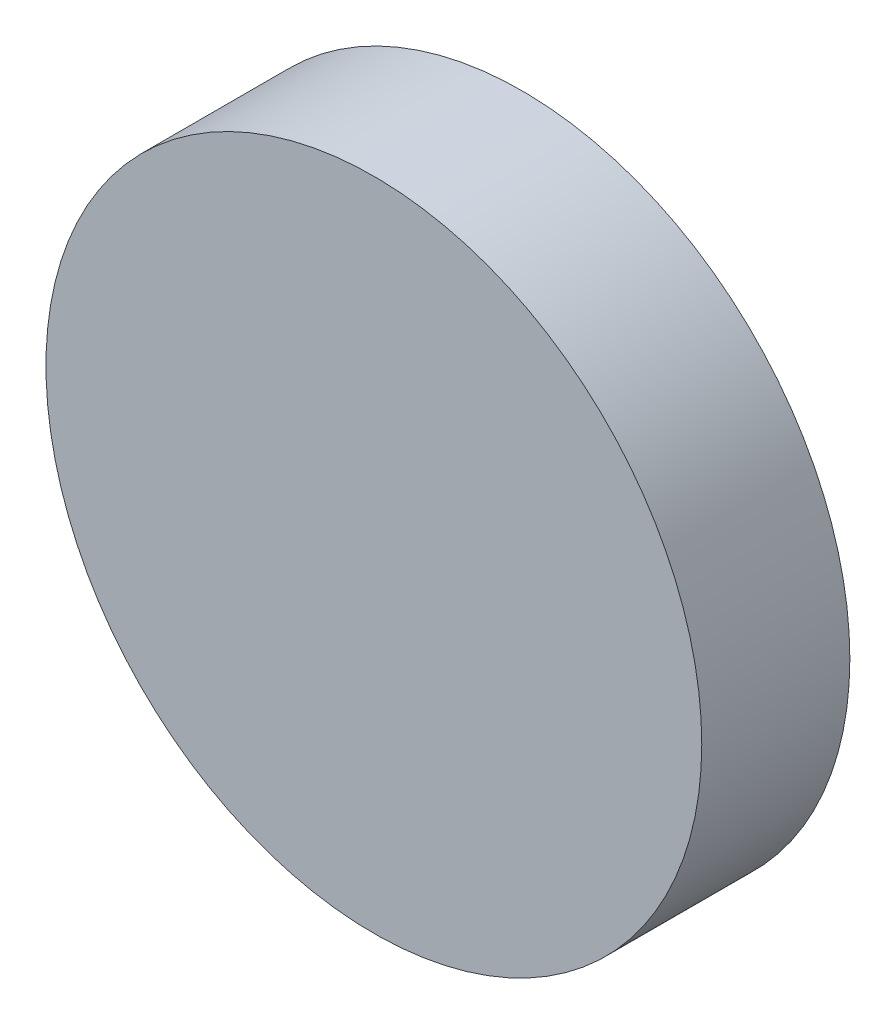
ISO-10303-21;
HEADER;
FILE_DESCRIPTION(('STEP AP214'),'2;1');
FILE_NAME('part.step','',(''),(''),'','','');
FILE_SCHEMA(('AUTOMOTIVE_DESIGN { 1 0 10303 214 1 1 1 1 }'));
ENDSEC;
DATA;
#1=APPLICATION_CONTEXT('core data for automotive mechanical design processes');
#2=APPLICATION_PROTOCOL_DEFINITION('international standard','automotive_design',2000,#1);
#3=PRODUCT_CONTEXT('',#1,'mechanical');
#4=PRODUCT('Part','Part','',(#3));
#5=PRODUCT_RELATED_PRODUCT_CATEGORY('part','',(#4));
#6=PRODUCT_DEFINITION_FORMATION('','',#4);
#7=PRODUCT_DEFINITION_CONTEXT('part definition',#1,'design');
#8=PRODUCT_DEFINITION('design','',#6,#7);
#9=PRODUCT_DEFINITION_SHAPE('','',#8);
#10=(LENGTH_UNIT() NAMED_UNIT(*) SI_UNIT(.MILLI.,.METRE.));
#11=(NAMED_UNIT(*) PLANE_ANGLE_UNIT() SI_UNIT($,.RADIAN.));
#12=(NAMED_UNIT(*) SI_UNIT($,.STERADIAN.) SOLID_ANGLE_UNIT());
#13=UNCERTAINTY_MEASURE_WITH_UNIT(LENGTH_MEASURE(1.E-05),#10,'distance_accuracy_value','');
#14=(GEOMETRIC_REPRESENTATION_CONTEXT(3) GLOBAL_UNCERTAINTY_ASSIGNED_CONTEXT((#13)) GLOBAL_UNIT_ASSIGNED_CONTEXT((#10,
#11,#12)) REPRESENTATION_CONTEXT('',''));
#15=CARTESIAN_POINT('',(0.,0.,0.));
#16=DIRECTION('',(0.,0.,1.));
#17=DIRECTION('',(1.,0.,0.));
#18=AXIS2_PLACEMENT_3D('',#15,#16,#17);
#19=CARTESIAN_POINT('',(0.,0.,14.));
#20=DIRECTION('',(0.,0.,-1.));
#21=DIRECTION('',(-1.,0.,0.));
#22=AXIS2_PLACEMENT_3D('',#19,#20,#21);
#23=CYLINDRICAL_SURFACE('',#22,30.9999999999999);
#24=CARTESIAN_POINT('',(0.,0.,14.));
#25=DIRECTION('',(0.,0.,1.));
#26=DIRECTION('',(1.,0.,0.));
#27=AXIS2_PLACEMENT_3D('',#24,#25,#26);
#28=CIRCLE('',#27,30.9999999999999);
#29=CARTESIAN_POINT('',(30.9999999999999,0.,14.));
#30=VERTEX_POINT('',#29);
#31=EDGE_CURVE('E10',#30,#30,#28,.T.);
#32=ORIENTED_EDGE('',*,*,#31,.F.);
#33=EDGE_LOOP('',(#32));
#34=FACE_BOUND('',#33,.T.);
#35=CARTESIAN_POINT('',(0.,0.,0.));
#36=DIRECTION('',(0.,0.,1.));
#37=DIRECTION('',(1.,0.,0.));
#38=AXIS2_PLACEMENT_3D('',#35,#36,#37);
#39=CIRCLE('',#38,30.9999999999999);
#40=CARTESIAN_POINT('',(30.9999999999999,0.,0.));
#41=VERTEX_POINT('',#40);
#42=EDGE_CURVE('E34',#41,#41,#39,.T.);
#43=ORIENTED_EDGE('',*,*,#42,.T.);
#44=EDGE_LOOP('',(#43));
#45=FACE_BOUND('',#44,.T.);
#46=ADVANCED_FACE('F31',(#34,#45),#23,.T.);
#47=CARTESIAN_POINT('',(0.,0.,14.));
#48=DIRECTION('',(0.,0.,1.));
#49=DIRECTION('',(1.,0.,0.));
#50=AXIS2_PLACEMENT_3D('',#47,#48,#49);
#51=PLANE('',#50);
#52=ORIENTED_EDGE('',*,*,#31,.T.);
#53=EDGE_LOOP('',(#52));
#54=FACE_BOUND('',#53,.T.);
#55=ADVANCED_FACE('F73',(#54),#51,.T.);
#56=CARTESIAN_POINT('',(0.,0.,0.));
#57=DIRECTION('',(0.,0.,1.));
#58=DIRECTION('',(1.,0.,0.));
#59=AXIS2_PLACEMENT_3D('',#56,#57,#58);
#60=PLANE('',#59);
#61=CARTESIAN_POINT('',(0.,0.,0.));
#62=DIRECTION('',(0.,0.,-1.));
#63=DIRECTION('',(-1.,0.,0.));
#64=AXIS2_PLACEMENT_3D('',#61,#62,#63);
#65=CIRCLE('',#64,22.5);
#66=CARTESIAN_POINT('',(-22.5,0.,0.));
#67=VERTEX_POINT('',#66);
#68=EDGE_CURVE('E43',#67,#67,#65,.T.);
#69=ORIENTED_EDGE('',*,*,#68,.F.);
#70=EDGE_LOOP('',(#69));
#71=FACE_BOUND('',#70,.T.);
#72=ORIENTED_EDGE('',*,*,#42,.F.);
#73=EDGE_LOOP('',(#72));
#74=FACE_BOUND('',#73,.T.);
#75=ADVANCED_FACE('F67',(#71,#74),#60,.F.);
#76=CARTESIAN_POINT('',(0.,0.,3.));
#77=DIRECTION('',(0.,0.,-1.));
#78=DIRECTION('',(-1.,0.,0.));
#79=AXIS2_PLACEMENT_3D('',#76,#77,#78);
#80=CYLINDRICAL_SURFACE('',#79,22.5);
#81=CARTESIAN_POINT('',(0.,0.,3.));
#82=DIRECTION('',(0.,0.,-1.));
#83=DIRECTION('',(-1.,0.,0.));
#84=AXIS2_PLACEMENT_3D('',#81,#82,#83);
#85=CIRCLE('',#84,22.5);
#86=CARTESIAN_POINT('',(-22.5,0.,3.));
#87=VERTEX_POINT('',#86);
#88=EDGE_CURVE('E41',#87,#87,#85,.T.);
#89=ORIENTED_EDGE('',*,*,#88,.F.);
#90=EDGE_LOOP('',(#89));
#91=FACE_BOUND('',#90,.T.);
#92=ORIENTED_EDGE('',*,*,#68,.T.);
#93=EDGE_LOOP('',(#92));
#94=FACE_BOUND('',#93,.T.);
#95=ADVANCED_FACE('F61',(#91,#94),#80,.F.);
#96=CARTESIAN_POINT('',(0.,0.,3.));
#97=DIRECTION('',(0.,0.,-1.));
#98=DIRECTION('',(-1.,0.,0.));
#99=AXIS2_PLACEMENT_3D('',#96,#97,#98);
#100=PLANE('',#99);
#101=CARTESIAN_POINT('',(0.,0.,3.));
#102=DIRECTION('',(0.,0.,-1.));
#103=DIRECTION('',(-1.,0.,0.));
#104=AXIS2_PLACEMENT_3D('',#101,#102,#103);
#105=CIRCLE('',#104,12.5);
#106=CARTESIAN_POINT('',(-12.5,0.,3.));
#107=VERTEX_POINT('',#106);
#108=EDGE_CURVE('E46',#107,#107,#105,.T.);
#109=ORIENTED_EDGE('',*,*,#108,.F.);
#110=EDGE_LOOP('',(#109));
#111=FACE_BOUND('',#110,.T.);
#112=ORIENTED_EDGE('',*,*,#88,.T.);
#113=EDGE_LOOP('',(#112));
#114=FACE_BOUND('',#113,.T.);
#115=ADVANCED_FACE('F58',(#111,#114),#100,.T.);
#116=CARTESIAN_POINT('',(0.,0.,3.));
#117=DIRECTION('',(0.,0.,-1.));
#118=DIRECTION('',(-1.,0.,0.));
#119=AXIS2_PLACEMENT_3D('',#116,#117,#118);
#120=CYLINDRICAL_SURFACE('',#119,12.5);
#121=ORIENTED_EDGE('',*,*,#108,.T.);
#122=EDGE_LOOP('',(#121));
#123=FACE_BOUND('',#122,.T.);
#124=CARTESIAN_POINT('',(0.,0.,0.));
#125=DIRECTION('',(0.,0.,-1.));
#126=DIRECTION('',(-1.,0.,0.));
#127=AXIS2_PLACEMENT_3D('',#124,#125,#126);
#128=CIRCLE('',#127,12.5);
#129=CARTESIAN_POINT('',(-12.5,0.,0.));
#130=VERTEX_POINT('',#129);
#131=EDGE_CURVE('E49',#130,#130,#128,.T.);
#132=ORIENTED_EDGE('',*,*,#131,.F.);
#133=EDGE_LOOP('',(#132));
#134=FACE_BOUND('',#133,.T.);
#135=ADVANCED_FACE('F55',(#123,#134),#120,.T.);
#136=ORIENTED_EDGE('',*,*,#131,.T.);
#137=EDGE_LOOP('',(#136));
#138=FACE_BOUND('',#137,.T.);
#139=ADVANCED_FACE('F74',(#138),#60,.F.);
#140=CLOSED_SHELL('',(#46,#55,#75,#95,#115,#135,#139));
#141=MANIFOLD_SOLID_BREP('B2',#140);
#142=ADVANCED_BREP_SHAPE_REPRESENTATION('',(#18,#141),#14);
#143=SHAPE_DEFINITION_REPRESENTATION(#9,#142);
ENDSEC;
END-ISO-10303-21;
